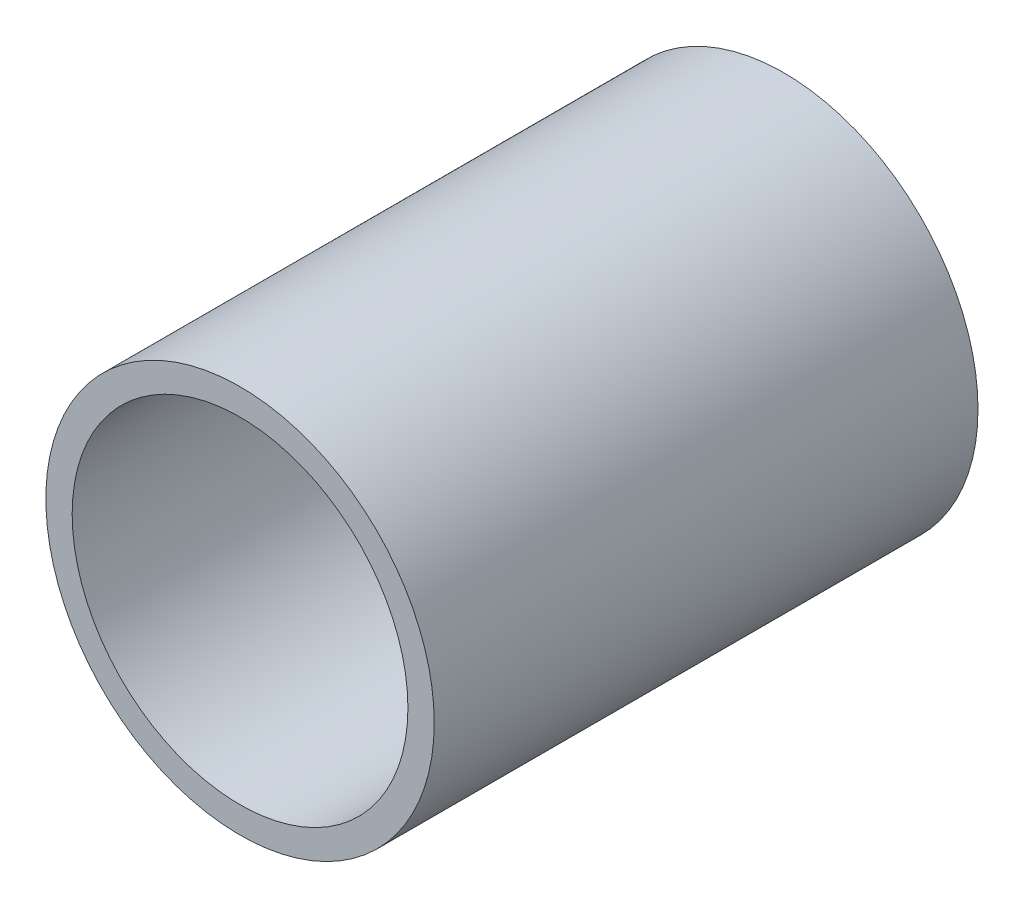
ISO-10303-21;
HEADER;
FILE_DESCRIPTION(('STEP AP214'),'2;1');
FILE_NAME('part.step','',(''),(''),'','','');
FILE_SCHEMA(('AUTOMOTIVE_DESIGN { 1 0 10303 214 1 1 1 1 }'));
ENDSEC;
DATA;
#1=APPLICATION_CONTEXT('core data for automotive mechanical design processes');
#2=APPLICATION_PROTOCOL_DEFINITION('international standard','automotive_design',2000,#1);
#3=PRODUCT_CONTEXT('',#1,'mechanical');
#4=PRODUCT('Part','Part','',(#3));
#5=PRODUCT_RELATED_PRODUCT_CATEGORY('part','',(#4));
#6=PRODUCT_DEFINITION_FORMATION('','',#4);
#7=PRODUCT_DEFINITION_CONTEXT('part definition',#1,'design');
#8=PRODUCT_DEFINITION('design','',#6,#7);
#9=PRODUCT_DEFINITION_SHAPE('','',#8);
#10=(LENGTH_UNIT() NAMED_UNIT(*) SI_UNIT(.MILLI.,.METRE.));
#11=(NAMED_UNIT(*) PLANE_ANGLE_UNIT() SI_UNIT($,.RADIAN.));
#12=(NAMED_UNIT(*) SI_UNIT($,.STERADIAN.) SOLID_ANGLE_UNIT());
#13=UNCERTAINTY_MEASURE_WITH_UNIT(LENGTH_MEASURE(1.E-05),#10,'distance_accuracy_value','');
#14=(GEOMETRIC_REPRESENTATION_CONTEXT(3) GLOBAL_UNCERTAINTY_ASSIGNED_CONTEXT((#13)) GLOBAL_UNIT_ASSIGNED_CONTEXT((#10,
#11,#12)) REPRESENTATION_CONTEXT('',''));
#15=CARTESIAN_POINT('',(0.,0.,0.));
#16=DIRECTION('',(0.,0.,1.));
#17=DIRECTION('',(1.,0.,0.));
#18=AXIS2_PLACEMENT_3D('',#15,#16,#17);
#19=CARTESIAN_POINT('',(0.,0.,70.));
#20=DIRECTION('',(0.,0.,-1.));
#21=DIRECTION('',(-1.,0.,0.));
#22=AXIS2_PLACEMENT_3D('',#19,#20,#21);
#23=CYLINDRICAL_SURFACE('',#22,25.);
#24=CARTESIAN_POINT('',(0.,0.,70.));
#25=DIRECTION('',(0.,0.,1.));
#26=DIRECTION('',(1.,0.,0.));
#27=AXIS2_PLACEMENT_3D('',#24,#25,#26);
#28=CIRCLE('',#27,25.);
#29=CARTESIAN_POINT('',(25.,0.,70.));
#30=VERTEX_POINT('',#29);
#31=EDGE_CURVE('E10',#30,#30,#28,.T.);
#32=ORIENTED_EDGE('',*,*,#31,.F.);
#33=EDGE_LOOP('',(#32));
#34=FACE_BOUND('',#33,.T.);
#35=CARTESIAN_POINT('',(0.,0.,0.));
#36=DIRECTION('',(0.,0.,1.));
#37=DIRECTION('',(1.,0.,0.));
#38=AXIS2_PLACEMENT_3D('',#35,#36,#37);
#39=CIRCLE('',#38,25.);
#40=CARTESIAN_POINT('',(25.,0.,0.));
#41=VERTEX_POINT('',#40);
#42=EDGE_CURVE('E39',#41,#41,#39,.T.);
#43=ORIENTED_EDGE('',*,*,#42,.T.);
#44=EDGE_LOOP('',(#43));
#45=FACE_BOUND('',#44,.T.);
#46=ADVANCED_FACE('F36',(#34,#45),#23,.T.);
#47=CARTESIAN_POINT('',(0.,0.,70.));
#48=DIRECTION('',(0.,0.,1.));
#49=DIRECTION('',(1.,0.,0.));
#50=AXIS2_PLACEMENT_3D('',#47,#48,#49);
#51=PLANE('',#50);
#52=CARTESIAN_POINT('',(0.,0.,70.));
#53=DIRECTION('',(0.,0.,1.));
#54=DIRECTION('',(1.,0.,0.));
#55=AXIS2_PLACEMENT_3D('',#52,#53,#54);
#56=CIRCLE('',#55,21.6118178061776);
#57=CARTESIAN_POINT('',(21.6118178061776,0.,70.));
#58=VERTEX_POINT('',#57);
#59=EDGE_CURVE('E50',#58,#58,#56,.T.);
#60=ORIENTED_EDGE('',*,*,#59,.F.);
#61=EDGE_LOOP('',(#60));
#62=FACE_BOUND('',#61,.T.);
#63=ORIENTED_EDGE('',*,*,#31,.T.);
#64=EDGE_LOOP('',(#63));
#65=FACE_BOUND('',#64,.T.);
#66=ADVANCED_FACE('F67',(#62,#65),#51,.T.);
#67=CARTESIAN_POINT('',(0.,0.,0.));
#68=DIRECTION('',(0.,0.,1.));
#69=DIRECTION('',(1.,0.,0.));
#70=AXIS2_PLACEMENT_3D('',#67,#68,#69);
#71=PLANE('',#70);
#72=ORIENTED_EDGE('',*,*,#42,.F.);
#73=EDGE_LOOP('',(#72));
#74=FACE_BOUND('',#73,.T.);
#75=ADVANCED_FACE('F63',(#74),#71,.F.);
#76=CARTESIAN_POINT('',(0.,0.,10.));
#77=DIRECTION('',(0.,0.,1.));
#78=DIRECTION('',(1.,0.,0.));
#79=AXIS2_PLACEMENT_3D('',#76,#77,#78);
#80=CYLINDRICAL_SURFACE('',#79,21.6118178061776);
#81=CARTESIAN_POINT('',(0.,0.,10.));
#82=DIRECTION('',(0.,0.,1.));
#83=DIRECTION('',(1.,0.,0.));
#84=AXIS2_PLACEMENT_3D('',#81,#82,#83);
#85=CIRCLE('',#84,21.6118178061776);
#86=CARTESIAN_POINT('',(21.6118178061776,0.,10.));
#87=VERTEX_POINT('',#86);
#88=EDGE_CURVE('E48',#87,#87,#85,.T.);
#89=CARTESIAN_POINT('',(21.6118178061776,0.,10.));
#90=CARTESIAN_POINT('',(21.6118178061776,0.,10.625));
#91=CARTESIAN_POINT('',(21.6118178061776,0.,11.25));
#92=CARTESIAN_POINT('',(21.6118178061776,0.,12.5));
#93=CARTESIAN_POINT('',(21.6118178061776,0.,13.125));
#94=CARTESIAN_POINT('',(21.6118178061776,0.,14.375));
#95=CARTESIAN_POINT('',(21.6118178061776,0.,15.));
#96=CARTESIAN_POINT('',(21.6118178061776,0.,16.25));
#97=CARTESIAN_POINT('',(21.6118178061776,0.,16.875));
#98=CARTESIAN_POINT('',(21.6118178061776,0.,18.125));
#99=CARTESIAN_POINT('',(21.6118178061776,0.,18.75));
#100=CARTESIAN_POINT('',(21.6118178061776,0.,20.));
#101=CARTESIAN_POINT('',(21.6118178061776,0.,20.625));
#102=CARTESIAN_POINT('',(21.6118178061776,0.,21.875));
#103=CARTESIAN_POINT('',(21.6118178061776,0.,22.5));
#104=CARTESIAN_POINT('',(21.6118178061776,0.,23.75));
#105=CARTESIAN_POINT('',(21.6118178061776,0.,24.375));
#106=CARTESIAN_POINT('',(21.6118178061776,0.,25.625));
#107=CARTESIAN_POINT('',(21.6118178061776,0.,26.25));
#108=CARTESIAN_POINT('',(21.6118178061776,0.,27.5));
#109=CARTESIAN_POINT('',(21.6118178061776,0.,28.125));
#110=CARTESIAN_POINT('',(21.6118178061776,0.,29.375));
#111=CARTESIAN_POINT('',(21.6118178061776,0.,30.));
#112=CARTESIAN_POINT('',(21.6118178061776,0.,31.25));
#113=CARTESIAN_POINT('',(21.6118178061776,0.,31.875));
#114=CARTESIAN_POINT('',(21.6118178061776,0.,33.125));
#115=CARTESIAN_POINT('',(21.6118178061776,0.,33.75));
#116=CARTESIAN_POINT('',(21.6118178061776,0.,35.));
#117=CARTESIAN_POINT('',(21.6118178061776,0.,35.625));
#118=CARTESIAN_POINT('',(21.6118178061776,0.,36.875));
#119=CARTESIAN_POINT('',(21.6118178061776,0.,37.5));
#120=CARTESIAN_POINT('',(21.6118178061776,0.,38.75));
#121=CARTESIAN_POINT('',(21.6118178061776,0.,39.375));
#122=CARTESIAN_POINT('',(21.6118178061776,0.,40.625));
#123=CARTESIAN_POINT('',(21.6118178061776,0.,41.25));
#124=CARTESIAN_POINT('',(21.6118178061776,0.,42.5));
#125=CARTESIAN_POINT('',(21.6118178061776,0.,43.125));
#126=CARTESIAN_POINT('',(21.6118178061776,0.,44.375));
#127=CARTESIAN_POINT('',(21.6118178061776,0.,45.));
#128=CARTESIAN_POINT('',(21.6118178061776,0.,46.25));
#129=CARTESIAN_POINT('',(21.6118178061776,0.,46.875));
#130=CARTESIAN_POINT('',(21.6118178061776,0.,48.125));
#131=CARTESIAN_POINT('',(21.6118178061776,0.,48.75));
#132=CARTESIAN_POINT('',(21.6118178061776,0.,50.));
#133=CARTESIAN_POINT('',(21.6118178061776,0.,50.625));
#134=CARTESIAN_POINT('',(21.6118178061776,0.,51.875));
#135=CARTESIAN_POINT('',(21.6118178061776,0.,52.5));
#136=CARTESIAN_POINT('',(21.6118178061776,0.,53.75));
#137=CARTESIAN_POINT('',(21.6118178061776,0.,54.375));
#138=CARTESIAN_POINT('',(21.6118178061776,0.,55.625));
#139=CARTESIAN_POINT('',(21.6118178061776,0.,56.25));
#140=CARTESIAN_POINT('',(21.6118178061776,0.,57.5));
#141=CARTESIAN_POINT('',(21.6118178061776,0.,58.125));
#142=CARTESIAN_POINT('',(21.6118178061776,0.,59.375));
#143=CARTESIAN_POINT('',(21.6118178061776,0.,60.));
#144=CARTESIAN_POINT('',(21.6118178061776,0.,61.25));
#145=CARTESIAN_POINT('',(21.6118178061776,0.,61.875));
#146=CARTESIAN_POINT('',(21.6118178061776,0.,63.125));
#147=CARTESIAN_POINT('',(21.6118178061776,0.,63.75));
#148=CARTESIAN_POINT('',(21.6118178061776,0.,65.));
#149=CARTESIAN_POINT('',(21.6118178061776,0.,65.625));
#150=CARTESIAN_POINT('',(21.6118178061776,0.,66.875));
#151=CARTESIAN_POINT('',(21.6118178061776,0.,67.5));
#152=CARTESIAN_POINT('',(21.6118178061776,0.,68.75));
#153=CARTESIAN_POINT('',(21.6118178061776,0.,69.375));
#154=CARTESIAN_POINT('',(21.6118178061776,0.,70.));
#155=B_SPLINE_CURVE_WITH_KNOTS('',3,(#89,#90,#91,#92,#93,#94,#95,#96,#97,#98,#99,#100,#101,#102,
#103,#104,#105,#106,#107,#108,#109,#110,#111,#112,#113,#114,#115,#116,#117,#118,#119,#120,#121,
#122,#123,#124,#125,#126,#127,#128,#129,#130,#131,#132,#133,#134,#135,#136,#137,#138,#139,#140,
#141,#142,#143,#144,#145,#146,#147,#148,#149,#150,#151,#152,#153,#154),.UNSPECIFIED.,.F.,.F.,(4,
2,2,2,2,2,2,2,2,2,2,2,2,2,2,2,2,2,2,2,2,2,2,2,2,2,2,2,2,2,2,2,4),(0.,1.875,3.75,5.625,7.5,9.375,
11.25,13.125,15.,16.875,18.75,20.625,22.5,24.375,26.25,28.125,30.,31.875,33.75,35.625,37.5,
39.375,41.25,43.125,45.,46.875,48.75,50.625,52.5,54.375,56.25,58.125,60.),.UNSPECIFIED.);
#156=EDGE_CURVE('BSEAM60',#87,#58,#155,.T.);
#157=ORIENTED_EDGE('',*,*,#88,.F.);
#158=ORIENTED_EDGE('',*,*,#59,.T.);
#159=ORIENTED_EDGE('',*,*,#156,.T.);
#160=ORIENTED_EDGE('',*,*,#156,.F.);
#161=EDGE_LOOP('',(#157,#159,#158,#160));
#162=FACE_BOUND('',#161,.T.);
#163=ADVANCED_FACE('F60',(#162),#80,.F.);
#164=CARTESIAN_POINT('',(0.,0.,10.));
#165=DIRECTION('',(0.,0.,1.));
#166=DIRECTION('',(1.,0.,0.));
#167=AXIS2_PLACEMENT_3D('',#164,#165,#166);
#168=PLANE('',#167);
#169=ORIENTED_EDGE('',*,*,#88,.T.);
#170=EDGE_LOOP('',(#169));
#171=FACE_BOUND('',#170,.T.);
#172=ADVANCED_FACE('F58',(#171),#168,.T.);
#173=CLOSED_SHELL('',(#46,#66,#75,#163,#172));
#174=MANIFOLD_SOLID_BREP('B2',#173);
#175=ADVANCED_BREP_SHAPE_REPRESENTATION('',(#18,#174),#14);
#176=SHAPE_DEFINITION_REPRESENTATION(#9,#175);
ENDSEC;
END-ISO-10303-21;
